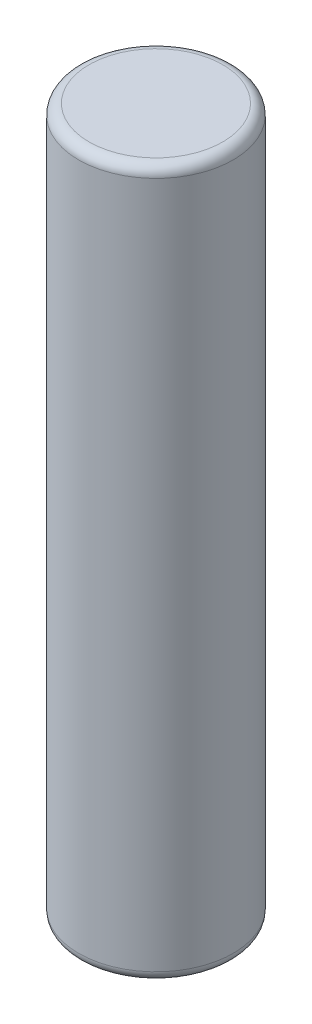
ISO-10303-21;
HEADER;
FILE_DESCRIPTION(('STEP AP214'),'2;1');
FILE_NAME('part.step','',(''),(''),'','','');
FILE_SCHEMA(('AUTOMOTIVE_DESIGN { 1 0 10303 214 1 1 1 1 }'));
ENDSEC;
DATA;
#1=APPLICATION_CONTEXT('core data for automotive mechanical design processes');
#2=APPLICATION_PROTOCOL_DEFINITION('international standard','automotive_design',2000,#1);
#3=PRODUCT_CONTEXT('',#1,'mechanical');
#4=PRODUCT('Part','Part','',(#3));
#5=PRODUCT_RELATED_PRODUCT_CATEGORY('part','',(#4));
#6=PRODUCT_DEFINITION_FORMATION('','',#4);
#7=PRODUCT_DEFINITION_CONTEXT('part definition',#1,'design');
#8=PRODUCT_DEFINITION('design','',#6,#7);
#9=PRODUCT_DEFINITION_SHAPE('','',#8);
#10=(LENGTH_UNIT() NAMED_UNIT(*) SI_UNIT(.MILLI.,.METRE.));
#11=(NAMED_UNIT(*) PLANE_ANGLE_UNIT() SI_UNIT($,.RADIAN.));
#12=(NAMED_UNIT(*) SI_UNIT($,.STERADIAN.) SOLID_ANGLE_UNIT());
#13=UNCERTAINTY_MEASURE_WITH_UNIT(LENGTH_MEASURE(1.E-05),#10,'distance_accuracy_value','');
#14=(GEOMETRIC_REPRESENTATION_CONTEXT(3) GLOBAL_UNCERTAINTY_ASSIGNED_CONTEXT((#13)) GLOBAL_UNIT_ASSIGNED_CONTEXT((#10,
#11,#12)) REPRESENTATION_CONTEXT('',''));
#15=CARTESIAN_POINT('',(0.,0.,0.));
#16=DIRECTION('',(0.,0.,1.));
#17=DIRECTION('',(1.,0.,0.));
#18=AXIS2_PLACEMENT_3D('',#15,#16,#17);
#19=CARTESIAN_POINT('',(0.,68.,0.));
#20=DIRECTION('',(0.,-1.,0.));
#21=DIRECTION('',(0.,0.,-1.));
#22=AXIS2_PLACEMENT_3D('',#19,#20,#21);
#23=CYLINDRICAL_SURFACE('',#22,7.425);
#24=CARTESIAN_POINT('',(0.,1.,0.));
#25=DIRECTION('',(0.,1.,0.));
#26=DIRECTION('',(0.,0.,1.));
#27=AXIS2_PLACEMENT_3D('',#24,#25,#26);
#28=CIRCLE('',#27,7.425);
#29=CARTESIAN_POINT('',(0.,1.,7.425));
#30=VERTEX_POINT('',#29);
#31=EDGE_CURVE('E48',#30,#30,#28,.T.);
#32=ORIENTED_EDGE('',*,*,#31,.T.);
#33=EDGE_LOOP('',(#32));
#34=FACE_BOUND('',#33,.T.);
#35=CARTESIAN_POINT('',(0.,67.,0.));
#36=DIRECTION('',(0.,1.,0.));
#37=DIRECTION('',(0.,0.,1.));
#38=AXIS2_PLACEMENT_3D('',#35,#36,#37);
#39=CIRCLE('',#38,7.425);
#40=CARTESIAN_POINT('',(0.,67.,7.425));
#41=VERTEX_POINT('',#40);
#42=EDGE_CURVE('E52',#41,#41,#39,.F.);
#43=ORIENTED_EDGE('',*,*,#42,.T.);
#44=EDGE_LOOP('',(#43));
#45=FACE_BOUND('',#44,.T.);
#46=ADVANCED_FACE('F37',(#34,#45),#23,.T.);
#47=CARTESIAN_POINT('',(0.,68.,0.));
#48=DIRECTION('',(0.,1.,0.));
#49=DIRECTION('',(0.,0.,1.));
#50=AXIS2_PLACEMENT_3D('',#47,#48,#49);
#51=PLANE('',#50);
#52=CARTESIAN_POINT('',(0.,68.,0.));
#53=DIRECTION('',(0.,1.,0.));
#54=DIRECTION('',(0.,0.,1.));
#55=AXIS2_PLACEMENT_3D('',#52,#53,#54);
#56=CIRCLE('',#55,6.425);
#57=CARTESIAN_POINT('',(0.,68.,6.425));
#58=VERTEX_POINT('',#57);
#59=EDGE_CURVE('E10',#58,#58,#56,.T.);
#60=ORIENTED_EDGE('',*,*,#59,.T.);
#61=EDGE_LOOP('',(#60));
#62=FACE_BOUND('',#61,.T.);
#63=ADVANCED_FACE('F68',(#62),#51,.T.);
#64=CARTESIAN_POINT('',(0.,0.,0.));
#65=DIRECTION('',(0.,1.,0.));
#66=DIRECTION('',(0.,0.,1.));
#67=AXIS2_PLACEMENT_3D('',#64,#65,#66);
#68=PLANE('',#67);
#69=CARTESIAN_POINT('',(0.,0.,0.));
#70=DIRECTION('',(0.,1.,0.));
#71=DIRECTION('',(0.,0.,1.));
#72=AXIS2_PLACEMENT_3D('',#69,#70,#71);
#73=CIRCLE('',#72,6.425);
#74=CARTESIAN_POINT('',(0.,0.,6.425));
#75=VERTEX_POINT('',#74);
#76=EDGE_CURVE('E44',#75,#75,#73,.F.);
#77=ORIENTED_EDGE('',*,*,#76,.T.);
#78=EDGE_LOOP('',(#77));
#79=FACE_BOUND('',#78,.T.);
#80=ADVANCED_FACE('F65',(#79),#68,.F.);
#81=CARTESIAN_POINT('',(0.,1.,0.));
#82=DIRECTION('',(0.,1.,0.));
#83=DIRECTION('',(0.,0.,1.));
#84=AXIS2_PLACEMENT_3D('',#81,#82,#83);
#85=TOROIDAL_SURFACE('',#84,6.425,1.);
#86=ORIENTED_EDGE('',*,*,#76,.F.);
#87=EDGE_LOOP('',(#86));
#88=FACE_BOUND('',#87,.T.);
#89=ORIENTED_EDGE('',*,*,#31,.F.);
#90=EDGE_LOOP('',(#89));
#91=FACE_BOUND('',#90,.T.);
#92=ADVANCED_FACE('F61',(#88,#91),#85,.T.);
#93=CARTESIAN_POINT('',(0.,67.,0.));
#94=DIRECTION('',(0.,1.,0.));
#95=DIRECTION('',(0.,0.,1.));
#96=AXIS2_PLACEMENT_3D('',#93,#94,#95);
#97=TOROIDAL_SURFACE('',#96,6.425,1.);
#98=ORIENTED_EDGE('',*,*,#42,.F.);
#99=EDGE_LOOP('',(#98));
#100=FACE_BOUND('',#99,.T.);
#101=ORIENTED_EDGE('',*,*,#59,.F.);
#102=EDGE_LOOP('',(#101));
#103=FACE_BOUND('',#102,.T.);
#104=ADVANCED_FACE('F39',(#100,#103),#97,.T.);
#105=CLOSED_SHELL('',(#46,#63,#80,#92,#104));
#106=MANIFOLD_SOLID_BREP('B2',#105);
#107=ADVANCED_BREP_SHAPE_REPRESENTATION('',(#18,#106),#14);
#108=SHAPE_DEFINITION_REPRESENTATION(#9,#107);
ENDSEC;
END-ISO-10303-21;
